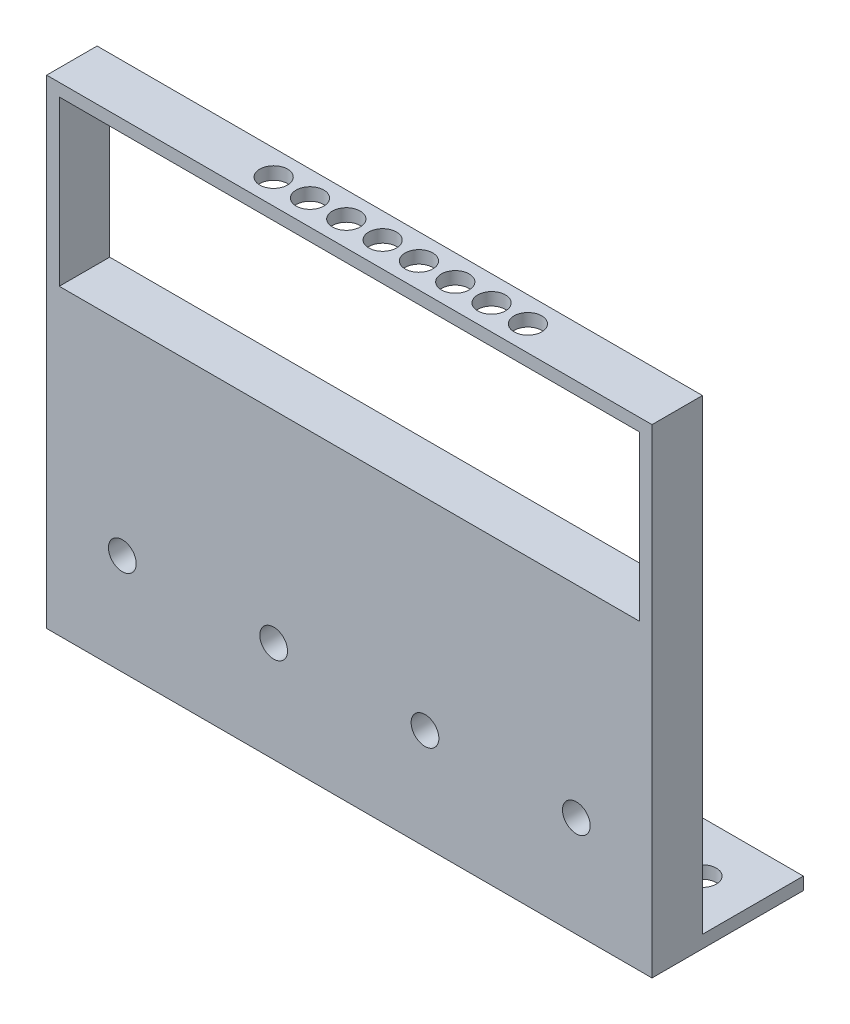
ISO-10303-21;
HEADER;
FILE_DESCRIPTION(('STEP AP214'),'2;1');
FILE_NAME('part.step','',(''),(''),'','','');
FILE_SCHEMA(('AUTOMOTIVE_DESIGN { 1 0 10303 214 1 1 1 1 }'));
ENDSEC;
DATA;
#1=APPLICATION_CONTEXT('core data for automotive mechanical design processes');
#2=APPLICATION_PROTOCOL_DEFINITION('international standard','automotive_design',2000,#1);
#3=PRODUCT_CONTEXT('',#1,'mechanical');
#4=PRODUCT('Part','Part','',(#3));
#5=PRODUCT_RELATED_PRODUCT_CATEGORY('part','',(#4));
#6=PRODUCT_DEFINITION_FORMATION('','',#4);
#7=PRODUCT_DEFINITION_CONTEXT('part definition',#1,'design');
#8=PRODUCT_DEFINITION('design','',#6,#7);
#9=PRODUCT_DEFINITION_SHAPE('','',#8);
#10=(LENGTH_UNIT() NAMED_UNIT(*) SI_UNIT(.MILLI.,.METRE.));
#11=(NAMED_UNIT(*) PLANE_ANGLE_UNIT() SI_UNIT($,.RADIAN.));
#12=(NAMED_UNIT(*) SI_UNIT($,.STERADIAN.) SOLID_ANGLE_UNIT());
#13=UNCERTAINTY_MEASURE_WITH_UNIT(LENGTH_MEASURE(1.E-05),#10,'distance_accuracy_value','');
#14=(GEOMETRIC_REPRESENTATION_CONTEXT(3) GLOBAL_UNCERTAINTY_ASSIGNED_CONTEXT((#13)) GLOBAL_UNIT_ASSIGNED_CONTEXT((#10,
#11,#12)) REPRESENTATION_CONTEXT('',''));
#15=CARTESIAN_POINT('',(0.,0.,0.));
#16=DIRECTION('',(0.,0.,1.));
#17=DIRECTION('',(1.,0.,0.));
#18=AXIS2_PLACEMENT_3D('',#15,#16,#17);
#19=CARTESIAN_POINT('',(-76.2,76.2,-6.35));
#20=DIRECTION('',(0.,0.,1.));
#21=DIRECTION('',(1.,0.,0.));
#22=AXIS2_PLACEMENT_3D('',#19,#20,#21);
#23=PLANE('',#22);
#24=CARTESIAN_POINT('',(-19.05,25.4,-6.35));
#25=DIRECTION('',(0.,0.,1.));
#26=DIRECTION('',(1.,0.,0.));
#27=AXIS2_PLACEMENT_3D('',#24,#25,#26);
#28=CIRCLE('',#27,3.49250000000001);
#29=CARTESIAN_POINT('',(-15.5575,25.4,-6.35));
#30=VERTEX_POINT('',#29);
#31=EDGE_CURVE('E309',#30,#30,#28,.T.);
#32=ORIENTED_EDGE('',*,*,#31,.T.);
#33=EDGE_LOOP('',(#32));
#34=FACE_BOUND('',#33,.T.);
#35=CARTESIAN_POINT('',(19.05,25.4,-6.35));
#36=DIRECTION('',(0.,0.,1.));
#37=DIRECTION('',(1.,0.,0.));
#38=AXIS2_PLACEMENT_3D('',#35,#36,#37);
#39=CIRCLE('',#38,3.49250000000001);
#40=CARTESIAN_POINT('',(22.5425,25.4,-6.35));
#41=VERTEX_POINT('',#40);
#42=EDGE_CURVE('E312',#41,#41,#39,.T.);
#43=ORIENTED_EDGE('',*,*,#42,.T.);
#44=EDGE_LOOP('',(#43));
#45=FACE_BOUND('',#44,.T.);
#46=CARTESIAN_POINT('',(57.15,25.4,-6.35));
#47=DIRECTION('',(0.,0.,1.));
#48=DIRECTION('',(1.,0.,0.));
#49=AXIS2_PLACEMENT_3D('',#46,#47,#48);
#50=CIRCLE('',#49,3.49250000000001);
#51=CARTESIAN_POINT('',(60.6425,25.4,-6.35));
#52=VERTEX_POINT('',#51);
#53=EDGE_CURVE('E315',#52,#52,#50,.T.);
#54=ORIENTED_EDGE('',*,*,#53,.T.);
#55=EDGE_LOOP('',(#54));
#56=FACE_BOUND('',#55,.T.);
#57=CARTESIAN_POINT('',(-57.15,25.4,-6.35));
#58=DIRECTION('',(0.,0.,1.));
#59=DIRECTION('',(1.,0.,0.));
#60=AXIS2_PLACEMENT_3D('',#57,#58,#59);
#61=CIRCLE('',#60,3.49250000000001);
#62=CARTESIAN_POINT('',(-53.6575,25.4,-6.35));
#63=VERTEX_POINT('',#62);
#64=EDGE_CURVE('E266',#63,#63,#61,.T.);
#65=ORIENTED_EDGE('',*,*,#64,.T.);
#66=EDGE_LOOP('',(#65));
#67=FACE_BOUND('',#66,.T.);
#68=DIRECTION('',(-1.,0.,0.));
#69=VECTOR('',#68,1.);
#70=CARTESIAN_POINT('',(-76.2,76.2,-6.35));
#71=LINE('',#70,#69);
#72=CARTESIAN_POINT('',(73.025,76.2,-6.34999999999999));
#73=VERTEX_POINT('',#72);
#74=CARTESIAN_POINT('',(-73.025,76.2,-6.35));
#75=VERTEX_POINT('',#74);
#76=EDGE_CURVE('E213',#73,#75,#71,.T.);
#77=ORIENTED_EDGE('',*,*,#76,.F.);
#78=DIRECTION('',(0.,1.,0.));
#79=VECTOR('',#78,1.);
#80=CARTESIAN_POINT('',(73.025,76.2,-6.34999999999999));
#81=LINE('',#80,#79);
#82=CARTESIAN_POINT('',(73.025,117.475,-6.34999999999999));
#83=VERTEX_POINT('',#82);
#84=EDGE_CURVE('E254',#73,#83,#81,.T.);
#85=ORIENTED_EDGE('',*,*,#84,.T.);
#86=DIRECTION('',(-1.,0.,0.));
#87=VECTOR('',#86,1.);
#88=CARTESIAN_POINT('',(73.025,117.475,-6.34999999999999));
#89=LINE('',#88,#87);
#90=CARTESIAN_POINT('',(-73.025,117.475,-6.34999999999999));
#91=VERTEX_POINT('',#90);
#92=EDGE_CURVE('E148',#83,#91,#89,.T.);
#93=ORIENTED_EDGE('',*,*,#92,.T.);
#94=DIRECTION('',(0.,-1.,0.));
#95=VECTOR('',#94,1.);
#96=CARTESIAN_POINT('',(-73.025,117.475,-6.34999999999999));
#97=LINE('',#96,#95);
#98=EDGE_CURVE('E116',#91,#75,#97,.T.);
#99=ORIENTED_EDGE('',*,*,#98,.T.);
#100=EDGE_LOOP('',(#77,#85,#93,#99));
#101=FACE_BOUND('',#100,.T.);
#102=DIRECTION('',(1.,0.,0.));
#103=VECTOR('',#102,1.);
#104=CARTESIAN_POINT('',(-76.2,3.175,-6.35));
#105=LINE('',#104,#103);
#106=CARTESIAN_POINT('',(-76.2,3.17500000000003,-6.35));
#107=VERTEX_POINT('',#106);
#108=CARTESIAN_POINT('',(76.2,3.175,-6.35));
#109=VERTEX_POINT('',#108);
#110=EDGE_CURVE('E197',#107,#109,#105,.T.);
#111=ORIENTED_EDGE('',*,*,#110,.F.);
#112=DIRECTION('',(0.,-1.,0.));
#113=VECTOR('',#112,1.);
#114=CARTESIAN_POINT('',(-76.2,76.2,-6.35));
#115=LINE('',#114,#113);
#116=CARTESIAN_POINT('',(-76.2,120.65,-6.34999999999999));
#117=VERTEX_POINT('',#116);
#118=EDGE_CURVE('E42',#117,#107,#115,.T.);
#119=ORIENTED_EDGE('',*,*,#118,.F.);
#120=DIRECTION('',(1.,0.,0.));
#121=VECTOR('',#120,1.);
#122=CARTESIAN_POINT('',(-76.2,120.65,-6.34999999999999));
#123=LINE('',#122,#121);
#124=CARTESIAN_POINT('',(76.2,120.65,-6.34999999999999));
#125=VERTEX_POINT('',#124);
#126=EDGE_CURVE('E138',#117,#125,#123,.T.);
#127=ORIENTED_EDGE('',*,*,#126,.T.);
#128=DIRECTION('',(0.,-1.,0.));
#129=VECTOR('',#128,1.);
#130=CARTESIAN_POINT('',(76.2,76.2,-6.35));
#131=LINE('',#130,#129);
#132=EDGE_CURVE('E11',#125,#109,#131,.T.);
#133=ORIENTED_EDGE('',*,*,#132,.T.);
#134=EDGE_LOOP('',(#111,#119,#127,#133));
#135=FACE_BOUND('',#134,.T.);
#136=ADVANCED_FACE('F34',(#34,#45,#56,#67,#101,#135),#23,.F.);
#137=CARTESIAN_POINT('',(76.2,76.2,6.35));
#138=DIRECTION('',(-1.,0.,0.));
#139=DIRECTION('',(0.,0.,1.));
#140=AXIS2_PLACEMENT_3D('',#137,#138,#139);
#141=PLANE('',#140);
#142=DIRECTION('',(0.,0.,-1.));
#143=VECTOR('',#142,1.);
#144=CARTESIAN_POINT('',(76.2,0.,6.35));
#145=LINE('',#144,#143);
#146=CARTESIAN_POINT('',(76.2,0.,6.35));
#147=VERTEX_POINT('',#146);
#148=CARTESIAN_POINT('',(76.2,0.,-31.75));
#149=VERTEX_POINT('',#148);
#150=EDGE_CURVE('E212',#147,#149,#145,.T.);
#151=ORIENTED_EDGE('',*,*,#150,.T.);
#152=DIRECTION('',(0.,-1.,0.));
#153=VECTOR('',#152,1.);
#154=CARTESIAN_POINT('',(76.2,3.175,-31.75));
#155=LINE('',#154,#153);
#156=CARTESIAN_POINT('',(76.2,3.175,-31.75));
#157=VERTEX_POINT('',#156);
#158=EDGE_CURVE('E209',#157,#149,#155,.T.);
#159=ORIENTED_EDGE('',*,*,#158,.F.);
#160=DIRECTION('',(0.,0.,-1.));
#161=VECTOR('',#160,1.);
#162=CARTESIAN_POINT('',(76.2,3.175,-6.35));
#163=LINE('',#162,#161);
#164=EDGE_CURVE('E200',#109,#157,#163,.T.);
#165=ORIENTED_EDGE('',*,*,#164,.F.);
#166=ORIENTED_EDGE('',*,*,#132,.F.);
#167=DIRECTION('',(0.,0.,1.));
#168=VECTOR('',#167,1.);
#169=CARTESIAN_POINT('',(76.2,120.65,-165.1));
#170=LINE('',#169,#168);
#171=CARTESIAN_POINT('',(76.2,120.65,6.35));
#172=VERTEX_POINT('',#171);
#173=EDGE_CURVE('E149',#125,#172,#170,.T.);
#174=ORIENTED_EDGE('',*,*,#173,.T.);
#175=DIRECTION('',(0.,-1.,0.));
#176=VECTOR('',#175,1.);
#177=CARTESIAN_POINT('',(76.2,76.2,6.35));
#178=LINE('',#177,#176);
#179=EDGE_CURVE('E217',#172,#147,#178,.T.);
#180=ORIENTED_EDGE('',*,*,#179,.T.);
#181=EDGE_LOOP('',(#151,#159,#165,#166,#174,#180));
#182=FACE_BOUND('',#181,.T.);
#183=ADVANCED_FACE('F36',(#182),#141,.F.);
#184=CARTESIAN_POINT('',(-76.2,76.2,6.35));
#185=DIRECTION('',(1.,0.,0.));
#186=DIRECTION('',(0.,0.,-1.));
#187=AXIS2_PLACEMENT_3D('',#184,#185,#186);
#188=PLANE('',#187);
#189=DIRECTION('',(0.,0.,1.));
#190=VECTOR('',#189,1.);
#191=CARTESIAN_POINT('',(-76.2,0.,6.35));
#192=LINE('',#191,#190);
#193=CARTESIAN_POINT('',(-76.2,0.,-31.75));
#194=VERTEX_POINT('',#193);
#195=CARTESIAN_POINT('',(-76.2,0.,6.35));
#196=VERTEX_POINT('',#195);
#197=EDGE_CURVE('E219',#194,#196,#192,.T.);
#198=ORIENTED_EDGE('',*,*,#197,.T.);
#199=DIRECTION('',(0.,-1.,0.));
#200=VECTOR('',#199,1.);
#201=CARTESIAN_POINT('',(-76.2,76.2,6.35));
#202=LINE('',#201,#200);
#203=CARTESIAN_POINT('',(-76.2,120.65,6.35));
#204=VERTEX_POINT('',#203);
#205=EDGE_CURVE('E224',#204,#196,#202,.T.);
#206=ORIENTED_EDGE('',*,*,#205,.F.);
#207=DIRECTION('',(0.,0.,1.));
#208=VECTOR('',#207,1.);
#209=CARTESIAN_POINT('',(-76.2,120.65,-165.1));
#210=LINE('',#209,#208);
#211=EDGE_CURVE('E145',#117,#204,#210,.T.);
#212=ORIENTED_EDGE('',*,*,#211,.F.);
#213=ORIENTED_EDGE('',*,*,#118,.T.);
#214=DIRECTION('',(0.,0.,1.));
#215=VECTOR('',#214,1.);
#216=CARTESIAN_POINT('',(-76.2,3.175,-19.05));
#217=LINE('',#216,#215);
#218=CARTESIAN_POINT('',(-76.2,3.175,-31.75));
#219=VERTEX_POINT('',#218);
#220=EDGE_CURVE('E194',#219,#107,#217,.T.);
#221=ORIENTED_EDGE('',*,*,#220,.F.);
#222=DIRECTION('',(0.,-1.,0.));
#223=VECTOR('',#222,1.);
#224=CARTESIAN_POINT('',(-76.2,3.175,-31.75));
#225=LINE('',#224,#223);
#226=EDGE_CURVE('E204',#219,#194,#225,.T.);
#227=ORIENTED_EDGE('',*,*,#226,.T.);
#228=EDGE_LOOP('',(#198,#206,#212,#213,#221,#227));
#229=FACE_BOUND('',#228,.T.);
#230=ADVANCED_FACE('F230',(#229),#188,.F.);
#231=CARTESIAN_POINT('',(-76.2,76.2,6.35));
#232=DIRECTION('',(0.,0.,-1.));
#233=DIRECTION('',(-1.,0.,0.));
#234=AXIS2_PLACEMENT_3D('',#231,#232,#233);
#235=PLANE('',#234);
#236=CARTESIAN_POINT('',(-19.05,25.4,6.35));
#237=DIRECTION('',(0.,0.,1.));
#238=DIRECTION('',(1.,0.,0.));
#239=AXIS2_PLACEMENT_3D('',#236,#237,#238);
#240=CIRCLE('',#239,3.49250000000001);
#241=CARTESIAN_POINT('',(-15.5575,25.4,6.35));
#242=VERTEX_POINT('',#241);
#243=EDGE_CURVE('E318',#242,#242,#240,.T.);
#244=ORIENTED_EDGE('',*,*,#243,.F.);
#245=EDGE_LOOP('',(#244));
#246=FACE_BOUND('',#245,.T.);
#247=CARTESIAN_POINT('',(19.05,25.4,6.35));
#248=DIRECTION('',(0.,0.,1.));
#249=DIRECTION('',(1.,0.,0.));
#250=AXIS2_PLACEMENT_3D('',#247,#248,#249);
#251=CIRCLE('',#250,3.49250000000001);
#252=CARTESIAN_POINT('',(22.5425,25.4,6.35));
#253=VERTEX_POINT('',#252);
#254=EDGE_CURVE('E322',#253,#253,#251,.T.);
#255=ORIENTED_EDGE('',*,*,#254,.F.);
#256=EDGE_LOOP('',(#255));
#257=FACE_BOUND('',#256,.T.);
#258=CARTESIAN_POINT('',(57.15,25.4,6.35));
#259=DIRECTION('',(0.,0.,1.));
#260=DIRECTION('',(1.,0.,0.));
#261=AXIS2_PLACEMENT_3D('',#258,#259,#260);
#262=CIRCLE('',#261,3.49250000000001);
#263=CARTESIAN_POINT('',(60.6425,25.4,6.35));
#264=VERTEX_POINT('',#263);
#265=EDGE_CURVE('E319',#264,#264,#262,.T.);
#266=ORIENTED_EDGE('',*,*,#265,.F.);
#267=EDGE_LOOP('',(#266));
#268=FACE_BOUND('',#267,.T.);
#269=CARTESIAN_POINT('',(-57.15,25.4,6.35));
#270=DIRECTION('',(0.,0.,1.));
#271=DIRECTION('',(1.,0.,0.));
#272=AXIS2_PLACEMENT_3D('',#269,#270,#271);
#273=CIRCLE('',#272,3.49250000000001);
#274=CARTESIAN_POINT('',(-53.6575,25.4,6.35));
#275=VERTEX_POINT('',#274);
#276=EDGE_CURVE('E306',#275,#275,#273,.T.);
#277=ORIENTED_EDGE('',*,*,#276,.F.);
#278=EDGE_LOOP('',(#277));
#279=FACE_BOUND('',#278,.T.);
#280=DIRECTION('',(1.,0.,0.));
#281=VECTOR('',#280,1.);
#282=CARTESIAN_POINT('',(-76.2,76.2,6.35));
#283=LINE('',#282,#281);
#284=CARTESIAN_POINT('',(-73.025,76.2,6.35));
#285=VERTEX_POINT('',#284);
#286=CARTESIAN_POINT('',(73.025,76.2,6.35));
#287=VERTEX_POINT('',#286);
#288=EDGE_CURVE('E49',#285,#287,#283,.T.);
#289=ORIENTED_EDGE('',*,*,#288,.F.);
#290=DIRECTION('',(0.,1.,0.));
#291=VECTOR('',#290,1.);
#292=CARTESIAN_POINT('',(-73.025,117.475,6.35));
#293=LINE('',#292,#291);
#294=CARTESIAN_POINT('',(-73.025,117.475,6.35));
#295=VERTEX_POINT('',#294);
#296=EDGE_CURVE('E114',#285,#295,#293,.T.);
#297=ORIENTED_EDGE('',*,*,#296,.T.);
#298=DIRECTION('',(1.,0.,0.));
#299=VECTOR('',#298,1.);
#300=CARTESIAN_POINT('',(73.025,117.475,6.35));
#301=LINE('',#300,#299);
#302=CARTESIAN_POINT('',(73.025,117.475,6.35));
#303=VERTEX_POINT('',#302);
#304=EDGE_CURVE('E122',#295,#303,#301,.T.);
#305=ORIENTED_EDGE('',*,*,#304,.T.);
#306=DIRECTION('',(0.,-1.,0.));
#307=VECTOR('',#306,1.);
#308=CARTESIAN_POINT('',(73.025,76.2,6.35));
#309=LINE('',#308,#307);
#310=EDGE_CURVE('E128',#303,#287,#309,.T.);
#311=ORIENTED_EDGE('',*,*,#310,.T.);
#312=EDGE_LOOP('',(#289,#297,#305,#311));
#313=FACE_BOUND('',#312,.T.);
#314=DIRECTION('',(1.,0.,0.));
#315=VECTOR('',#314,1.);
#316=CARTESIAN_POINT('',(-76.2,0.,6.35));
#317=LINE('',#316,#315);
#318=EDGE_CURVE('E215',#196,#147,#317,.T.);
#319=ORIENTED_EDGE('',*,*,#318,.T.);
#320=ORIENTED_EDGE('',*,*,#179,.F.);
#321=DIRECTION('',(-1.,0.,0.));
#322=VECTOR('',#321,1.);
#323=CARTESIAN_POINT('',(-76.2,120.65,6.35));
#324=LINE('',#323,#322);
#325=EDGE_CURVE('E142',#172,#204,#324,.T.);
#326=ORIENTED_EDGE('',*,*,#325,.T.);
#327=ORIENTED_EDGE('',*,*,#205,.T.);
#328=EDGE_LOOP('',(#319,#320,#326,#327));
#329=FACE_BOUND('',#328,.T.);
#330=ADVANCED_FACE('F130',(#246,#257,#268,#279,#313,#329),#235,.F.);
#331=CARTESIAN_POINT('',(0.,76.2,0.));
#332=DIRECTION('',(0.,-1.,0.));
#333=DIRECTION('',(0.,0.,-1.));
#334=AXIS2_PLACEMENT_3D('',#331,#332,#333);
#335=PLANE('',#334);
#336=ORIENTED_EDGE('',*,*,#288,.T.);
#337=DIRECTION('',(0.,0.,1.));
#338=VECTOR('',#337,1.);
#339=CARTESIAN_POINT('',(73.025,76.2,-165.1));
#340=LINE('',#339,#338);
#341=EDGE_CURVE('E152',#73,#287,#340,.T.);
#342=ORIENTED_EDGE('',*,*,#341,.F.);
#343=ORIENTED_EDGE('',*,*,#76,.T.);
#344=DIRECTION('',(0.,0.,1.));
#345=VECTOR('',#344,1.);
#346=CARTESIAN_POINT('',(-73.025,76.2,-165.1));
#347=LINE('',#346,#345);
#348=EDGE_CURVE('E54',#75,#285,#347,.T.);
#349=ORIENTED_EDGE('',*,*,#348,.T.);
#350=EDGE_LOOP('',(#336,#342,#343,#349));
#351=FACE_BOUND('',#350,.T.);
#352=ADVANCED_FACE('F333',(#351),#335,.F.);
#353=CARTESIAN_POINT('',(0.,0.,0.));
#354=DIRECTION('',(0.,-1.,0.));
#355=DIRECTION('',(0.,0.,-1.));
#356=AXIS2_PLACEMENT_3D('',#353,#354,#355);
#357=PLANE('',#356);
#358=ORIENTED_EDGE('',*,*,#150,.F.);
#359=ORIENTED_EDGE('',*,*,#318,.F.);
#360=ORIENTED_EDGE('',*,*,#197,.F.);
#361=DIRECTION('',(-1.,0.,0.));
#362=VECTOR('',#361,1.);
#363=CARTESIAN_POINT('',(76.2,0.,-31.75));
#364=LINE('',#363,#362);
#365=EDGE_CURVE('E191',#149,#194,#364,.T.);
#366=ORIENTED_EDGE('',*,*,#365,.F.);
#367=EDGE_LOOP('',(#358,#359,#360,#366));
#368=FACE_BOUND('',#367,.T.);
#369=CARTESIAN_POINT('',(-63.5,0.,-19.05));
#370=DIRECTION('',(0.,1.,0.));
#371=DIRECTION('',(0.,0.,1.));
#372=AXIS2_PLACEMENT_3D('',#369,#370,#371);
#373=CIRCLE('',#372,3.49250000000001);
#374=CARTESIAN_POINT('',(-63.5,0.,-15.5575));
#375=VERTEX_POINT('',#374);
#376=EDGE_CURVE('E185',#375,#375,#373,.T.);
#377=ORIENTED_EDGE('',*,*,#376,.T.);
#378=EDGE_LOOP('',(#377));
#379=FACE_BOUND('',#378,.T.);
#380=CARTESIAN_POINT('',(-38.1,0.,-19.05));
#381=DIRECTION('',(0.,1.,0.));
#382=DIRECTION('',(0.,0.,1.));
#383=AXIS2_PLACEMENT_3D('',#380,#381,#382);
#384=CIRCLE('',#383,3.49250000000001);
#385=CARTESIAN_POINT('',(-38.1,0.,-15.5575));
#386=VERTEX_POINT('',#385);
#387=EDGE_CURVE('E179',#386,#386,#384,.T.);
#388=ORIENTED_EDGE('',*,*,#387,.T.);
#389=EDGE_LOOP('',(#388));
#390=FACE_BOUND('',#389,.T.);
#391=CARTESIAN_POINT('',(-12.7,0.,-19.05));
#392=DIRECTION('',(0.,1.,0.));
#393=DIRECTION('',(0.,0.,1.));
#394=AXIS2_PLACEMENT_3D('',#391,#392,#393);
#395=CIRCLE('',#394,3.4925);
#396=CARTESIAN_POINT('',(-12.7,0.,-15.5575));
#397=VERTEX_POINT('',#396);
#398=EDGE_CURVE('E173',#397,#397,#395,.T.);
#399=ORIENTED_EDGE('',*,*,#398,.T.);
#400=EDGE_LOOP('',(#399));
#401=FACE_BOUND('',#400,.T.);
#402=CARTESIAN_POINT('',(12.7,0.,-19.05));
#403=DIRECTION('',(0.,1.,0.));
#404=DIRECTION('',(0.,0.,1.));
#405=AXIS2_PLACEMENT_3D('',#402,#403,#404);
#406=CIRCLE('',#405,3.4925);
#407=CARTESIAN_POINT('',(12.7,0.,-15.5575));
#408=VERTEX_POINT('',#407);
#409=EDGE_CURVE('E167',#408,#408,#406,.T.);
#410=ORIENTED_EDGE('',*,*,#409,.T.);
#411=EDGE_LOOP('',(#410));
#412=FACE_BOUND('',#411,.T.);
#413=CARTESIAN_POINT('',(38.1,0.,-19.05));
#414=DIRECTION('',(0.,1.,0.));
#415=DIRECTION('',(0.,0.,1.));
#416=AXIS2_PLACEMENT_3D('',#413,#414,#415);
#417=CIRCLE('',#416,3.49250000000001);
#418=CARTESIAN_POINT('',(38.1,0.,-15.5575));
#419=VERTEX_POINT('',#418);
#420=EDGE_CURVE('E161',#419,#419,#417,.T.);
#421=ORIENTED_EDGE('',*,*,#420,.T.);
#422=EDGE_LOOP('',(#421));
#423=FACE_BOUND('',#422,.T.);
#424=CARTESIAN_POINT('',(63.4999999999999,0.,-19.05));
#425=DIRECTION('',(0.,1.,0.));
#426=DIRECTION('',(0.,0.,1.));
#427=AXIS2_PLACEMENT_3D('',#424,#425,#426);
#428=CIRCLE('',#427,3.49249999999999);
#429=CARTESIAN_POINT('',(63.4999999999999,0.,-15.5575));
#430=VERTEX_POINT('',#429);
#431=EDGE_CURVE('E157',#430,#430,#428,.T.);
#432=ORIENTED_EDGE('',*,*,#431,.T.);
#433=EDGE_LOOP('',(#432));
#434=FACE_BOUND('',#433,.T.);
#435=ADVANCED_FACE('F248',(#368,#379,#390,#401,#412,#423,#434),#357,.T.);
#436=CARTESIAN_POINT('',(0.,3.175,0.));
#437=DIRECTION('',(0.,1.,0.));
#438=DIRECTION('',(0.,0.,1.));
#439=AXIS2_PLACEMENT_3D('',#436,#437,#438);
#440=PLANE('',#439);
#441=CARTESIAN_POINT('',(38.1,3.175,-19.05));
#442=DIRECTION('',(0.,1.,0.));
#443=DIRECTION('',(0.,0.,1.));
#444=AXIS2_PLACEMENT_3D('',#441,#442,#443);
#445=CIRCLE('',#444,3.49250000000001);
#446=CARTESIAN_POINT('',(38.1,3.175,-15.5575));
#447=VERTEX_POINT('',#446);
#448=EDGE_CURVE('E164',#447,#447,#445,.T.);
#449=ORIENTED_EDGE('',*,*,#448,.F.);
#450=EDGE_LOOP('',(#449));
#451=FACE_BOUND('',#450,.T.);
#452=CARTESIAN_POINT('',(-12.7,3.175,-19.05));
#453=DIRECTION('',(0.,1.,0.));
#454=DIRECTION('',(0.,0.,1.));
#455=AXIS2_PLACEMENT_3D('',#452,#453,#454);
#456=CIRCLE('',#455,3.4925);
#457=CARTESIAN_POINT('',(-12.7,3.175,-15.5575));
#458=VERTEX_POINT('',#457);
#459=EDGE_CURVE('E176',#458,#458,#456,.T.);
#460=ORIENTED_EDGE('',*,*,#459,.F.);
#461=EDGE_LOOP('',(#460));
#462=FACE_BOUND('',#461,.T.);
#463=CARTESIAN_POINT('',(-63.5,3.175,-19.05));
#464=DIRECTION('',(0.,1.,0.));
#465=DIRECTION('',(0.,0.,1.));
#466=AXIS2_PLACEMENT_3D('',#463,#464,#465);
#467=CIRCLE('',#466,3.49250000000001);
#468=CARTESIAN_POINT('',(-63.5,3.175,-15.5575));
#469=VERTEX_POINT('',#468);
#470=EDGE_CURVE('E188',#469,#469,#467,.T.);
#471=ORIENTED_EDGE('',*,*,#470,.F.);
#472=EDGE_LOOP('',(#471));
#473=FACE_BOUND('',#472,.T.);
#474=ORIENTED_EDGE('',*,*,#220,.T.);
#475=ORIENTED_EDGE('',*,*,#110,.T.);
#476=ORIENTED_EDGE('',*,*,#164,.T.);
#477=DIRECTION('',(-1.,0.,0.));
#478=VECTOR('',#477,1.);
#479=CARTESIAN_POINT('',(76.2,3.175,-31.75));
#480=LINE('',#479,#478);
#481=EDGE_CURVE('E202',#157,#219,#480,.T.);
#482=ORIENTED_EDGE('',*,*,#481,.T.);
#483=EDGE_LOOP('',(#474,#475,#476,#482));
#484=FACE_BOUND('',#483,.T.);
#485=CARTESIAN_POINT('',(-38.1,3.175,-19.05));
#486=DIRECTION('',(0.,1.,0.));
#487=DIRECTION('',(0.,0.,1.));
#488=AXIS2_PLACEMENT_3D('',#485,#486,#487);
#489=CIRCLE('',#488,3.49250000000001);
#490=CARTESIAN_POINT('',(-38.1,3.175,-15.5575));
#491=VERTEX_POINT('',#490);
#492=EDGE_CURVE('E182',#491,#491,#489,.T.);
#493=ORIENTED_EDGE('',*,*,#492,.F.);
#494=EDGE_LOOP('',(#493));
#495=FACE_BOUND('',#494,.T.);
#496=CARTESIAN_POINT('',(12.7,3.175,-19.05));
#497=DIRECTION('',(0.,1.,0.));
#498=DIRECTION('',(0.,0.,1.));
#499=AXIS2_PLACEMENT_3D('',#496,#497,#498);
#500=CIRCLE('',#499,3.4925);
#501=CARTESIAN_POINT('',(12.7,3.175,-15.5575));
#502=VERTEX_POINT('',#501);
#503=EDGE_CURVE('E170',#502,#502,#500,.T.);
#504=ORIENTED_EDGE('',*,*,#503,.F.);
#505=EDGE_LOOP('',(#504));
#506=FACE_BOUND('',#505,.T.);
#507=CARTESIAN_POINT('',(63.4999999999999,3.175,-19.05));
#508=DIRECTION('',(0.,1.,0.));
#509=DIRECTION('',(0.,0.,1.));
#510=AXIS2_PLACEMENT_3D('',#507,#508,#509);
#511=CIRCLE('',#510,3.49249999999999);
#512=CARTESIAN_POINT('',(63.4999999999999,3.175,-15.5575));
#513=VERTEX_POINT('',#512);
#514=EDGE_CURVE('E158',#513,#513,#511,.T.);
#515=ORIENTED_EDGE('',*,*,#514,.F.);
#516=EDGE_LOOP('',(#515));
#517=FACE_BOUND('',#516,.T.);
#518=ADVANCED_FACE('F235',(#451,#462,#473,#484,#495,#506,#517),#440,.T.);
#519=CARTESIAN_POINT('',(76.2,3.175,-31.75));
#520=DIRECTION('',(0.,0.,1.));
#521=DIRECTION('',(1.,0.,0.));
#522=AXIS2_PLACEMENT_3D('',#519,#520,#521);
#523=PLANE('',#522);
#524=ORIENTED_EDGE('',*,*,#365,.T.);
#525=ORIENTED_EDGE('',*,*,#226,.F.);
#526=ORIENTED_EDGE('',*,*,#481,.F.);
#527=ORIENTED_EDGE('',*,*,#158,.T.);
#528=EDGE_LOOP('',(#524,#525,#526,#527));
#529=FACE_BOUND('',#528,.T.);
#530=ADVANCED_FACE('F242',(#529),#523,.F.);
#531=CARTESIAN_POINT('',(-63.5,3.175,-19.05));
#532=DIRECTION('',(0.,-1.,0.));
#533=DIRECTION('',(0.,0.,-1.));
#534=AXIS2_PLACEMENT_3D('',#531,#532,#533);
#535=CYLINDRICAL_SURFACE('',#534,3.49250000000001);
#536=ORIENTED_EDGE('',*,*,#470,.T.);
#537=EDGE_LOOP('',(#536));
#538=FACE_BOUND('',#537,.T.);
#539=ORIENTED_EDGE('',*,*,#376,.F.);
#540=EDGE_LOOP('',(#539));
#541=FACE_BOUND('',#540,.T.);
#542=ADVANCED_FACE('F387',(#538,#541),#535,.F.);
#543=CARTESIAN_POINT('',(-38.1,3.175,-19.05));
#544=DIRECTION('',(0.,-1.,0.));
#545=DIRECTION('',(0.,0.,-1.));
#546=AXIS2_PLACEMENT_3D('',#543,#544,#545);
#547=CYLINDRICAL_SURFACE('',#546,3.49250000000001);
#548=ORIENTED_EDGE('',*,*,#492,.T.);
#549=EDGE_LOOP('',(#548));
#550=FACE_BOUND('',#549,.T.);
#551=ORIENTED_EDGE('',*,*,#387,.F.);
#552=EDGE_LOOP('',(#551));
#553=FACE_BOUND('',#552,.T.);
#554=ADVANCED_FACE('F383',(#550,#553),#547,.F.);
#555=CARTESIAN_POINT('',(-12.7,3.175,-19.05));
#556=DIRECTION('',(0.,-1.,0.));
#557=DIRECTION('',(0.,0.,-1.));
#558=AXIS2_PLACEMENT_3D('',#555,#556,#557);
#559=CYLINDRICAL_SURFACE('',#558,3.4925);
#560=ORIENTED_EDGE('',*,*,#459,.T.);
#561=EDGE_LOOP('',(#560));
#562=FACE_BOUND('',#561,.T.);
#563=ORIENTED_EDGE('',*,*,#398,.F.);
#564=EDGE_LOOP('',(#563));
#565=FACE_BOUND('',#564,.T.);
#566=ADVANCED_FACE('F379',(#562,#565),#559,.F.);
#567=CARTESIAN_POINT('',(12.7,3.175,-19.05));
#568=DIRECTION('',(0.,-1.,0.));
#569=DIRECTION('',(0.,0.,-1.));
#570=AXIS2_PLACEMENT_3D('',#567,#568,#569);
#571=CYLINDRICAL_SURFACE('',#570,3.4925);
#572=ORIENTED_EDGE('',*,*,#503,.T.);
#573=EDGE_LOOP('',(#572));
#574=FACE_BOUND('',#573,.T.);
#575=ORIENTED_EDGE('',*,*,#409,.F.);
#576=EDGE_LOOP('',(#575));
#577=FACE_BOUND('',#576,.T.);
#578=ADVANCED_FACE('F375',(#574,#577),#571,.F.);
#579=CARTESIAN_POINT('',(38.1,3.175,-19.05));
#580=DIRECTION('',(0.,-1.,0.));
#581=DIRECTION('',(0.,0.,-1.));
#582=AXIS2_PLACEMENT_3D('',#579,#580,#581);
#583=CYLINDRICAL_SURFACE('',#582,3.49250000000001);
#584=ORIENTED_EDGE('',*,*,#448,.T.);
#585=EDGE_LOOP('',(#584));
#586=FACE_BOUND('',#585,.T.);
#587=ORIENTED_EDGE('',*,*,#420,.F.);
#588=EDGE_LOOP('',(#587));
#589=FACE_BOUND('',#588,.T.);
#590=ADVANCED_FACE('F371',(#586,#589),#583,.F.);
#591=CARTESIAN_POINT('',(63.4999999999999,3.175,-19.05));
#592=DIRECTION('',(0.,-1.,0.));
#593=DIRECTION('',(0.,0.,-1.));
#594=AXIS2_PLACEMENT_3D('',#591,#592,#593);
#595=CYLINDRICAL_SURFACE('',#594,3.49249999999999);
#596=ORIENTED_EDGE('',*,*,#514,.T.);
#597=EDGE_LOOP('',(#596));
#598=FACE_BOUND('',#597,.T.);
#599=ORIENTED_EDGE('',*,*,#431,.F.);
#600=EDGE_LOOP('',(#599));
#601=FACE_BOUND('',#600,.T.);
#602=ADVANCED_FACE('F361',(#598,#601),#595,.F.);
#603=CARTESIAN_POINT('',(-76.2,120.65,-165.1));
#604=DIRECTION('',(0.,1.,0.));
#605=DIRECTION('',(0.,0.,1.));
#606=AXIS2_PLACEMENT_3D('',#603,#604,#605);
#607=PLANE('',#606);
#608=CARTESIAN_POINT('',(-16.256,120.65,0.));
#609=DIRECTION('',(0.,1.,0.));
#610=DIRECTION('',(0.,0.,1.));
#611=AXIS2_PLACEMENT_3D('',#608,#609,#610);
#612=CIRCLE('',#611,3.4925);
#613=CARTESIAN_POINT('',(-16.256,120.65,3.4925));
#614=VERTEX_POINT('',#613);
#615=EDGE_CURVE('E260',#614,#614,#612,.T.);
#616=ORIENTED_EDGE('',*,*,#615,.F.);
#617=EDGE_LOOP('',(#616));
#618=FACE_BOUND('',#617,.T.);
#619=CARTESIAN_POINT('',(-7.11200000000002,120.65,0.));
#620=DIRECTION('',(0.,1.,0.));
#621=DIRECTION('',(0.,0.,1.));
#622=AXIS2_PLACEMENT_3D('',#619,#620,#621);
#623=CIRCLE('',#622,3.4925);
#624=CARTESIAN_POINT('',(-7.11200000000002,120.65,3.4925));
#625=VERTEX_POINT('',#624);
#626=EDGE_CURVE('E296',#625,#625,#623,.T.);
#627=ORIENTED_EDGE('',*,*,#626,.F.);
#628=EDGE_LOOP('',(#627));
#629=FACE_BOUND('',#628,.T.);
#630=CARTESIAN_POINT('',(2.03199999999998,120.65,0.));
#631=DIRECTION('',(0.,1.,0.));
#632=DIRECTION('',(0.,0.,1.));
#633=AXIS2_PLACEMENT_3D('',#630,#631,#632);
#634=CIRCLE('',#633,3.4925);
#635=CARTESIAN_POINT('',(2.03199999999998,120.65,3.4925));
#636=VERTEX_POINT('',#635);
#637=EDGE_CURVE('E290',#636,#636,#634,.T.);
#638=ORIENTED_EDGE('',*,*,#637,.F.);
#639=EDGE_LOOP('',(#638));
#640=FACE_BOUND('',#639,.T.);
#641=CARTESIAN_POINT('',(11.176,120.65,0.));
#642=DIRECTION('',(0.,1.,0.));
#643=DIRECTION('',(0.,0.,1.));
#644=AXIS2_PLACEMENT_3D('',#641,#642,#643);
#645=CIRCLE('',#644,3.4925);
#646=CARTESIAN_POINT('',(11.176,120.65,3.4925));
#647=VERTEX_POINT('',#646);
#648=EDGE_CURVE('E284',#647,#647,#645,.T.);
#649=ORIENTED_EDGE('',*,*,#648,.F.);
#650=EDGE_LOOP('',(#649));
#651=FACE_BOUND('',#650,.T.);
#652=CARTESIAN_POINT('',(20.32,120.65,0.));
#653=DIRECTION('',(0.,1.,0.));
#654=DIRECTION('',(0.,0.,1.));
#655=AXIS2_PLACEMENT_3D('',#652,#653,#654);
#656=CIRCLE('',#655,3.4925);
#657=CARTESIAN_POINT('',(20.32,120.65,3.4925));
#658=VERTEX_POINT('',#657);
#659=EDGE_CURVE('E278',#658,#658,#656,.T.);
#660=ORIENTED_EDGE('',*,*,#659,.F.);
#661=EDGE_LOOP('',(#660));
#662=FACE_BOUND('',#661,.T.);
#663=CARTESIAN_POINT('',(29.464,120.65,0.));
#664=DIRECTION('',(0.,1.,0.));
#665=DIRECTION('',(0.,0.,1.));
#666=AXIS2_PLACEMENT_3D('',#663,#664,#665);
#667=CIRCLE('',#666,3.49250000000001);
#668=CARTESIAN_POINT('',(29.464,120.65,3.49250000000001));
#669=VERTEX_POINT('',#668);
#670=EDGE_CURVE('E272',#669,#669,#667,.T.);
#671=ORIENTED_EDGE('',*,*,#670,.F.);
#672=EDGE_LOOP('',(#671));
#673=FACE_BOUND('',#672,.T.);
#674=CARTESIAN_POINT('',(38.608,120.65,0.));
#675=DIRECTION('',(0.,1.,0.));
#676=DIRECTION('',(0.,0.,1.));
#677=AXIS2_PLACEMENT_3D('',#674,#675,#676);
#678=CIRCLE('',#677,3.49250000000001);
#679=CARTESIAN_POINT('',(38.608,120.65,3.49250000000001));
#680=VERTEX_POINT('',#679);
#681=EDGE_CURVE('E265',#680,#680,#678,.T.);
#682=ORIENTED_EDGE('',*,*,#681,.F.);
#683=EDGE_LOOP('',(#682));
#684=FACE_BOUND('',#683,.T.);
#685=CARTESIAN_POINT('',(-25.4,120.65,0.));
#686=DIRECTION('',(0.,1.,0.));
#687=DIRECTION('',(0.,0.,1.));
#688=AXIS2_PLACEMENT_3D('',#685,#686,#687);
#689=CIRCLE('',#688,3.4925);
#690=CARTESIAN_POINT('',(-25.4,120.65,3.4925));
#691=VERTEX_POINT('',#690);
#692=EDGE_CURVE('E132',#691,#691,#689,.T.);
#693=ORIENTED_EDGE('',*,*,#692,.F.);
#694=EDGE_LOOP('',(#693));
#695=FACE_BOUND('',#694,.T.);
#696=ORIENTED_EDGE('',*,*,#126,.F.);
#697=ORIENTED_EDGE('',*,*,#211,.T.);
#698=ORIENTED_EDGE('',*,*,#325,.F.);
#699=ORIENTED_EDGE('',*,*,#173,.F.);
#700=EDGE_LOOP('',(#696,#697,#698,#699));
#701=FACE_BOUND('',#700,.T.);
#702=ADVANCED_FACE('F253',(#618,#629,#640,#651,#662,#673,#684,#695,#701),#607,.T.);
#703=CARTESIAN_POINT('',(73.025,76.2,-165.1));
#704=DIRECTION('',(-1.,0.,0.));
#705=DIRECTION('',(0.,0.,1.));
#706=AXIS2_PLACEMENT_3D('',#703,#704,#705);
#707=PLANE('',#706);
#708=ORIENTED_EDGE('',*,*,#84,.F.);
#709=ORIENTED_EDGE('',*,*,#341,.T.);
#710=ORIENTED_EDGE('',*,*,#310,.F.);
#711=DIRECTION('',(0.,0.,1.));
#712=VECTOR('',#711,1.);
#713=CARTESIAN_POINT('',(73.025,117.475,-165.1));
#714=LINE('',#713,#712);
#715=EDGE_CURVE('E119',#83,#303,#714,.T.);
#716=ORIENTED_EDGE('',*,*,#715,.F.);
#717=EDGE_LOOP('',(#708,#709,#710,#716));
#718=FACE_BOUND('',#717,.T.);
#719=ADVANCED_FACE('F352',(#718),#707,.T.);
#720=CARTESIAN_POINT('',(73.025,117.475,-165.1));
#721=DIRECTION('',(0.,-1.,0.));
#722=DIRECTION('',(1.,0.,0.));
#723=AXIS2_PLACEMENT_3D('',#720,#721,#722);
#724=PLANE('',#723);
#725=CARTESIAN_POINT('',(-16.256,117.475,0.));
#726=DIRECTION('',(0.,-1.,0.));
#727=DIRECTION('',(1.,0.,0.));
#728=AXIS2_PLACEMENT_3D('',#725,#726,#727);
#729=CIRCLE('',#728,3.4925);
#730=CARTESIAN_POINT('',(-12.7635,117.475,0.));
#731=VERTEX_POINT('',#730);
#732=EDGE_CURVE('E299',#731,#731,#729,.F.);
#733=ORIENTED_EDGE('',*,*,#732,.T.);
#734=EDGE_LOOP('',(#733));
#735=FACE_BOUND('',#734,.T.);
#736=CARTESIAN_POINT('',(-7.11200000000002,117.475,0.));
#737=DIRECTION('',(0.,-1.,0.));
#738=DIRECTION('',(1.,0.,0.));
#739=AXIS2_PLACEMENT_3D('',#736,#737,#738);
#740=CIRCLE('',#739,3.4925);
#741=CARTESIAN_POINT('',(-3.61950000000002,117.475,0.));
#742=VERTEX_POINT('',#741);
#743=EDGE_CURVE('E293',#742,#742,#740,.F.);
#744=ORIENTED_EDGE('',*,*,#743,.T.);
#745=EDGE_LOOP('',(#744));
#746=FACE_BOUND('',#745,.T.);
#747=CARTESIAN_POINT('',(2.03199999999998,117.475,0.));
#748=DIRECTION('',(0.,-1.,0.));
#749=DIRECTION('',(1.,0.,0.));
#750=AXIS2_PLACEMENT_3D('',#747,#748,#749);
#751=CIRCLE('',#750,3.4925);
#752=CARTESIAN_POINT('',(5.52449999999998,117.475,0.));
#753=VERTEX_POINT('',#752);
#754=EDGE_CURVE('E287',#753,#753,#751,.F.);
#755=ORIENTED_EDGE('',*,*,#754,.T.);
#756=EDGE_LOOP('',(#755));
#757=FACE_BOUND('',#756,.T.);
#758=CARTESIAN_POINT('',(11.176,117.475,0.));
#759=DIRECTION('',(0.,-1.,0.));
#760=DIRECTION('',(1.,0.,0.));
#761=AXIS2_PLACEMENT_3D('',#758,#759,#760);
#762=CIRCLE('',#761,3.4925);
#763=CARTESIAN_POINT('',(14.6685,117.475,0.));
#764=VERTEX_POINT('',#763);
#765=EDGE_CURVE('E281',#764,#764,#762,.F.);
#766=ORIENTED_EDGE('',*,*,#765,.T.);
#767=EDGE_LOOP('',(#766));
#768=FACE_BOUND('',#767,.T.);
#769=CARTESIAN_POINT('',(20.32,117.475,0.));
#770=DIRECTION('',(0.,-1.,0.));
#771=DIRECTION('',(1.,0.,0.));
#772=AXIS2_PLACEMENT_3D('',#769,#770,#771);
#773=CIRCLE('',#772,3.4925);
#774=CARTESIAN_POINT('',(23.8125,117.475,0.));
#775=VERTEX_POINT('',#774);
#776=EDGE_CURVE('E275',#775,#775,#773,.F.);
#777=ORIENTED_EDGE('',*,*,#776,.T.);
#778=EDGE_LOOP('',(#777));
#779=FACE_BOUND('',#778,.T.);
#780=CARTESIAN_POINT('',(29.464,117.475,0.));
#781=DIRECTION('',(0.,-1.,0.));
#782=DIRECTION('',(1.,0.,0.));
#783=AXIS2_PLACEMENT_3D('',#780,#781,#782);
#784=CIRCLE('',#783,3.49250000000001);
#785=CARTESIAN_POINT('',(32.9565,117.475,0.));
#786=VERTEX_POINT('',#785);
#787=EDGE_CURVE('E269',#786,#786,#784,.F.);
#788=ORIENTED_EDGE('',*,*,#787,.T.);
#789=EDGE_LOOP('',(#788));
#790=FACE_BOUND('',#789,.T.);
#791=CARTESIAN_POINT('',(38.608,117.475,0.));
#792=DIRECTION('',(0.,-1.,0.));
#793=DIRECTION('',(1.,0.,0.));
#794=AXIS2_PLACEMENT_3D('',#791,#792,#793);
#795=CIRCLE('',#794,3.49250000000001);
#796=CARTESIAN_POINT('',(42.1005,117.475,0.));
#797=VERTEX_POINT('',#796);
#798=EDGE_CURVE('E262',#797,#797,#795,.F.);
#799=ORIENTED_EDGE('',*,*,#798,.T.);
#800=EDGE_LOOP('',(#799));
#801=FACE_BOUND('',#800,.T.);
#802=CARTESIAN_POINT('',(-25.4,117.475,0.));
#803=DIRECTION('',(0.,-1.,0.));
#804=DIRECTION('',(1.,0.,0.));
#805=AXIS2_PLACEMENT_3D('',#802,#803,#804);
#806=CIRCLE('',#805,3.4925);
#807=CARTESIAN_POINT('',(-21.9075,117.475,0.));
#808=VERTEX_POINT('',#807);
#809=EDGE_CURVE('E135',#808,#808,#806,.F.);
#810=ORIENTED_EDGE('',*,*,#809,.T.);
#811=EDGE_LOOP('',(#810));
#812=FACE_BOUND('',#811,.T.);
#813=ORIENTED_EDGE('',*,*,#92,.F.);
#814=ORIENTED_EDGE('',*,*,#715,.T.);
#815=ORIENTED_EDGE('',*,*,#304,.F.);
#816=DIRECTION('',(0.,0.,1.));
#817=VECTOR('',#816,1.);
#818=CARTESIAN_POINT('',(-73.025,117.475,-165.1));
#819=LINE('',#818,#817);
#820=EDGE_CURVE('E110',#91,#295,#819,.T.);
#821=ORIENTED_EDGE('',*,*,#820,.F.);
#822=EDGE_LOOP('',(#813,#814,#815,#821));
#823=FACE_BOUND('',#822,.T.);
#824=ADVANCED_FACE('F123',(#735,#746,#757,#768,#779,#790,#801,#812,#823),#724,.T.);
#825=CARTESIAN_POINT('',(-73.025,117.475,-165.1));
#826=DIRECTION('',(1.,0.,0.));
#827=DIRECTION('',(0.,0.,-1.));
#828=AXIS2_PLACEMENT_3D('',#825,#826,#827);
#829=PLANE('',#828);
#830=ORIENTED_EDGE('',*,*,#98,.F.);
#831=ORIENTED_EDGE('',*,*,#820,.T.);
#832=ORIENTED_EDGE('',*,*,#296,.F.);
#833=ORIENTED_EDGE('',*,*,#348,.F.);
#834=EDGE_LOOP('',(#830,#831,#832,#833));
#835=FACE_BOUND('',#834,.T.);
#836=ADVANCED_FACE('F112',(#835),#829,.T.);
#837=CARTESIAN_POINT('',(-25.4,-0.001000000000001,0.));
#838=DIRECTION('',(0.,1.,0.));
#839=DIRECTION('',(0.,0.,1.));
#840=AXIS2_PLACEMENT_3D('',#837,#838,#839);
#841=CYLINDRICAL_SURFACE('',#840,3.4925);
#842=ORIENTED_EDGE('',*,*,#809,.F.);
#843=EDGE_LOOP('',(#842));
#844=FACE_BOUND('',#843,.T.);
#845=ORIENTED_EDGE('',*,*,#692,.T.);
#846=EDGE_LOOP('',(#845));
#847=FACE_BOUND('',#846,.T.);
#848=ADVANCED_FACE('F368',(#844,#847),#841,.F.);
#849=CARTESIAN_POINT('',(38.608,-0.001000000000001,0.));
#850=DIRECTION('',(0.,1.,0.));
#851=DIRECTION('',(0.,0.,1.));
#852=AXIS2_PLACEMENT_3D('',#849,#850,#851);
#853=CYLINDRICAL_SURFACE('',#852,3.49250000000001);
#854=ORIENTED_EDGE('',*,*,#798,.F.);
#855=EDGE_LOOP('',(#854));
#856=FACE_BOUND('',#855,.T.);
#857=ORIENTED_EDGE('',*,*,#681,.T.);
#858=EDGE_LOOP('',(#857));
#859=FACE_BOUND('',#858,.T.);
#860=ADVANCED_FACE('F487',(#856,#859),#853,.F.);
#861=CARTESIAN_POINT('',(29.464,-0.001000000000001,0.));
#862=DIRECTION('',(0.,1.,0.));
#863=DIRECTION('',(0.,0.,1.));
#864=AXIS2_PLACEMENT_3D('',#861,#862,#863);
#865=CYLINDRICAL_SURFACE('',#864,3.49250000000001);
#866=ORIENTED_EDGE('',*,*,#787,.F.);
#867=EDGE_LOOP('',(#866));
#868=FACE_BOUND('',#867,.T.);
#869=ORIENTED_EDGE('',*,*,#670,.T.);
#870=EDGE_LOOP('',(#869));
#871=FACE_BOUND('',#870,.T.);
#872=ADVANCED_FACE('F483',(#868,#871),#865,.F.);
#873=CARTESIAN_POINT('',(20.32,-0.001000000000001,0.));
#874=DIRECTION('',(0.,1.,0.));
#875=DIRECTION('',(0.,0.,1.));
#876=AXIS2_PLACEMENT_3D('',#873,#874,#875);
#877=CYLINDRICAL_SURFACE('',#876,3.4925);
#878=ORIENTED_EDGE('',*,*,#776,.F.);
#879=EDGE_LOOP('',(#878));
#880=FACE_BOUND('',#879,.T.);
#881=ORIENTED_EDGE('',*,*,#659,.T.);
#882=EDGE_LOOP('',(#881));
#883=FACE_BOUND('',#882,.T.);
#884=ADVANCED_FACE('F479',(#880,#883),#877,.F.);
#885=CARTESIAN_POINT('',(11.176,-0.001000000000001,0.));
#886=DIRECTION('',(0.,1.,0.));
#887=DIRECTION('',(0.,0.,1.));
#888=AXIS2_PLACEMENT_3D('',#885,#886,#887);
#889=CYLINDRICAL_SURFACE('',#888,3.4925);
#890=ORIENTED_EDGE('',*,*,#765,.F.);
#891=EDGE_LOOP('',(#890));
#892=FACE_BOUND('',#891,.T.);
#893=ORIENTED_EDGE('',*,*,#648,.T.);
#894=EDGE_LOOP('',(#893));
#895=FACE_BOUND('',#894,.T.);
#896=ADVANCED_FACE('F475',(#892,#895),#889,.F.);
#897=CARTESIAN_POINT('',(2.03199999999998,-0.001000000000001,0.));
#898=DIRECTION('',(0.,1.,0.));
#899=DIRECTION('',(0.,0.,1.));
#900=AXIS2_PLACEMENT_3D('',#897,#898,#899);
#901=CYLINDRICAL_SURFACE('',#900,3.4925);
#902=ORIENTED_EDGE('',*,*,#754,.F.);
#903=EDGE_LOOP('',(#902));
#904=FACE_BOUND('',#903,.T.);
#905=ORIENTED_EDGE('',*,*,#637,.T.);
#906=EDGE_LOOP('',(#905));
#907=FACE_BOUND('',#906,.T.);
#908=ADVANCED_FACE('F471',(#904,#907),#901,.F.);
#909=CARTESIAN_POINT('',(-7.11200000000002,-0.001000000000001,0.));
#910=DIRECTION('',(0.,1.,0.));
#911=DIRECTION('',(0.,0.,1.));
#912=AXIS2_PLACEMENT_3D('',#909,#910,#911);
#913=CYLINDRICAL_SURFACE('',#912,3.4925);
#914=ORIENTED_EDGE('',*,*,#743,.F.);
#915=EDGE_LOOP('',(#914));
#916=FACE_BOUND('',#915,.T.);
#917=ORIENTED_EDGE('',*,*,#626,.T.);
#918=EDGE_LOOP('',(#917));
#919=FACE_BOUND('',#918,.T.);
#920=ADVANCED_FACE('F467',(#916,#919),#913,.F.);
#921=CARTESIAN_POINT('',(-16.256,-0.001000000000001,0.));
#922=DIRECTION('',(0.,1.,0.));
#923=DIRECTION('',(0.,0.,1.));
#924=AXIS2_PLACEMENT_3D('',#921,#922,#923);
#925=CYLINDRICAL_SURFACE('',#924,3.4925);
#926=ORIENTED_EDGE('',*,*,#732,.F.);
#927=EDGE_LOOP('',(#926));
#928=FACE_BOUND('',#927,.T.);
#929=ORIENTED_EDGE('',*,*,#615,.T.);
#930=EDGE_LOOP('',(#929));
#931=FACE_BOUND('',#930,.T.);
#932=ADVANCED_FACE('F345',(#928,#931),#925,.F.);
#933=CARTESIAN_POINT('',(-57.15,25.4,-31.75));
#934=DIRECTION('',(0.,0.,1.));
#935=DIRECTION('',(1.,0.,0.));
#936=AXIS2_PLACEMENT_3D('',#933,#934,#935);
#937=CYLINDRICAL_SURFACE('',#936,3.49250000000001);
#938=ORIENTED_EDGE('',*,*,#276,.T.);
#939=EDGE_LOOP('',(#938));
#940=FACE_BOUND('',#939,.T.);
#941=ORIENTED_EDGE('',*,*,#64,.F.);
#942=EDGE_LOOP('',(#941));
#943=FACE_BOUND('',#942,.T.);
#944=ADVANCED_FACE('F341',(#940,#943),#937,.F.);
#945=CARTESIAN_POINT('',(57.15,25.4,-31.75));
#946=DIRECTION('',(0.,0.,1.));
#947=DIRECTION('',(1.,0.,0.));
#948=AXIS2_PLACEMENT_3D('',#945,#946,#947);
#949=CYLINDRICAL_SURFACE('',#948,3.49250000000001);
#950=ORIENTED_EDGE('',*,*,#265,.T.);
#951=EDGE_LOOP('',(#950));
#952=FACE_BOUND('',#951,.T.);
#953=ORIENTED_EDGE('',*,*,#53,.F.);
#954=EDGE_LOOP('',(#953));
#955=FACE_BOUND('',#954,.T.);
#956=ADVANCED_FACE('F344',(#952,#955),#949,.F.);
#957=CARTESIAN_POINT('',(19.05,25.4,-31.75));
#958=DIRECTION('',(0.,0.,1.));
#959=DIRECTION('',(1.,0.,0.));
#960=AXIS2_PLACEMENT_3D('',#957,#958,#959);
#961=CYLINDRICAL_SURFACE('',#960,3.49250000000001);
#962=ORIENTED_EDGE('',*,*,#254,.T.);
#963=EDGE_LOOP('',(#962));
#964=FACE_BOUND('',#963,.T.);
#965=ORIENTED_EDGE('',*,*,#42,.F.);
#966=EDGE_LOOP('',(#965));
#967=FACE_BOUND('',#966,.T.);
#968=ADVANCED_FACE('F443',(#964,#967),#961,.F.);
#969=CARTESIAN_POINT('',(-19.05,25.4,-31.75));
#970=DIRECTION('',(0.,0.,1.));
#971=DIRECTION('',(1.,0.,0.));
#972=AXIS2_PLACEMENT_3D('',#969,#970,#971);
#973=CYLINDRICAL_SURFACE('',#972,3.49250000000001);
#974=ORIENTED_EDGE('',*,*,#243,.T.);
#975=EDGE_LOOP('',(#974));
#976=FACE_BOUND('',#975,.T.);
#977=ORIENTED_EDGE('',*,*,#31,.F.);
#978=EDGE_LOOP('',(#977));
#979=FACE_BOUND('',#978,.T.);
#980=ADVANCED_FACE('F328',(#976,#979),#973,.F.);
#981=CLOSED_SHELL('',(#136,#183,#230,#330,#352,#435,#518,#530,#542,#554,#566,#578,#590,#602,
#702,#719,#824,#836,#848,#860,#872,#884,#896,#908,#920,#932,#944,#956,#968,#980));
#982=MANIFOLD_SOLID_BREP('B2',#981);
#983=ADVANCED_BREP_SHAPE_REPRESENTATION('',(#18,#982),#14);
#984=SHAPE_DEFINITION_REPRESENTATION(#9,#983);
ENDSEC;
END-ISO-10303-21;
